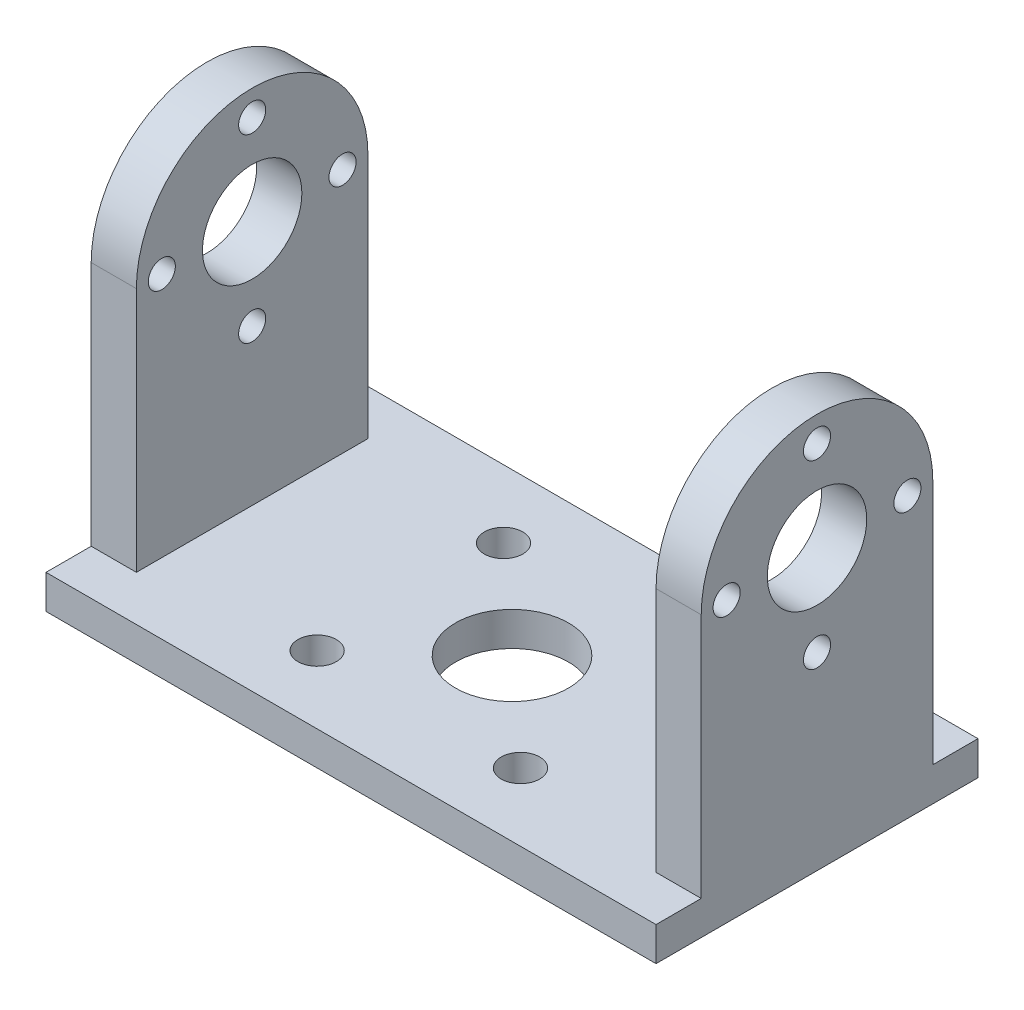
ISO-10303-21;
HEADER;
FILE_DESCRIPTION(('STEP AP214'),'2;1');
FILE_NAME('part.step','',(''),(''),'','','');
FILE_SCHEMA(('AUTOMOTIVE_DESIGN { 1 0 10303 214 1 1 1 1 }'));
ENDSEC;
DATA;
#1=APPLICATION_CONTEXT('core data for automotive mechanical design processes');
#2=APPLICATION_PROTOCOL_DEFINITION('international standard','automotive_design',2000,#1);
#3=PRODUCT_CONTEXT('',#1,'mechanical');
#4=PRODUCT('Part','Part','',(#3));
#5=PRODUCT_RELATED_PRODUCT_CATEGORY('part','',(#4));
#6=PRODUCT_DEFINITION_FORMATION('','',#4);
#7=PRODUCT_DEFINITION_CONTEXT('part definition',#1,'design');
#8=PRODUCT_DEFINITION('design','',#6,#7);
#9=PRODUCT_DEFINITION_SHAPE('','',#8);
#10=(LENGTH_UNIT() NAMED_UNIT(*) SI_UNIT(.MILLI.,.METRE.));
#11=(NAMED_UNIT(*) PLANE_ANGLE_UNIT() SI_UNIT($,.RADIAN.));
#12=(NAMED_UNIT(*) SI_UNIT($,.STERADIAN.) SOLID_ANGLE_UNIT());
#13=UNCERTAINTY_MEASURE_WITH_UNIT(LENGTH_MEASURE(1.E-05),#10,'distance_accuracy_value','');
#14=(GEOMETRIC_REPRESENTATION_CONTEXT(3) GLOBAL_UNCERTAINTY_ASSIGNED_CONTEXT((#13)) GLOBAL_UNIT_ASSIGNED_CONTEXT((#10,
#11,#12)) REPRESENTATION_CONTEXT('',''));
#15=CARTESIAN_POINT('',(0.,0.,0.));
#16=DIRECTION('',(0.,0.,1.));
#17=DIRECTION('',(1.,0.,0.));
#18=AXIS2_PLACEMENT_3D('',#15,#16,#17);
#19=CARTESIAN_POINT('',(0.,3.,-14.25));
#20=DIRECTION('',(0.,0.,1.));
#21=DIRECTION('',(1.,0.,0.));
#22=AXIS2_PLACEMENT_3D('',#19,#20,#21);
#23=PLANE('',#22);
#24=DIRECTION('',(-1.,0.,0.));
#25=VECTOR('',#24,1.);
#26=CARTESIAN_POINT('',(0.,0.,-14.25));
#27=LINE('',#26,#25);
#28=CARTESIAN_POINT('',(27.,0.,-14.25));
#29=VERTEX_POINT('',#28);
#30=CARTESIAN_POINT('',(-27.,0.,-14.25));
#31=VERTEX_POINT('',#30);
#32=EDGE_CURVE('E227',#29,#31,#27,.T.);
#33=ORIENTED_EDGE('',*,*,#32,.T.);
#34=DIRECTION('',(0.,-1.,0.));
#35=VECTOR('',#34,1.);
#36=CARTESIAN_POINT('',(-27.,3.,-14.25));
#37=LINE('',#36,#35);
#38=CARTESIAN_POINT('',(-27.,3.,-14.25));
#39=VERTEX_POINT('',#38);
#40=EDGE_CURVE('E11',#39,#31,#37,.T.);
#41=ORIENTED_EDGE('',*,*,#40,.F.);
#42=DIRECTION('',(-1.,0.,0.));
#43=VECTOR('',#42,1.);
#44=CARTESIAN_POINT('',(0.,3.,-14.25));
#45=LINE('',#44,#43);
#46=CARTESIAN_POINT('',(27.,3.,-14.25));
#47=VERTEX_POINT('',#46);
#48=EDGE_CURVE('E228',#47,#39,#45,.T.);
#49=ORIENTED_EDGE('',*,*,#48,.F.);
#50=DIRECTION('',(0.,-1.,0.));
#51=VECTOR('',#50,1.);
#52=CARTESIAN_POINT('',(27.,3.,-14.25));
#53=LINE('',#52,#51);
#54=EDGE_CURVE('E265',#47,#29,#53,.T.);
#55=ORIENTED_EDGE('',*,*,#54,.T.);
#56=EDGE_LOOP('',(#33,#41,#49,#55));
#57=FACE_BOUND('',#56,.T.);
#58=ADVANCED_FACE('F47',(#57),#23,.F.);
#59=CARTESIAN_POINT('',(-27.,3.,0.));
#60=DIRECTION('',(1.,0.,0.));
#61=DIRECTION('',(0.,0.,-1.));
#62=AXIS2_PLACEMENT_3D('',#59,#60,#61);
#63=PLANE('',#62);
#64=CARTESIAN_POINT('',(-27.,24.75,7.99999999999989));
#65=DIRECTION('',(1.,0.,0.));
#66=DIRECTION('',(0.,0.,-1.));
#67=AXIS2_PLACEMENT_3D('',#64,#65,#66);
#68=CIRCLE('',#67,1.2);
#69=CARTESIAN_POINT('',(-27.,24.75,6.79999999999989));
#70=VERTEX_POINT('',#69);
#71=EDGE_CURVE('E418',#70,#70,#68,.T.);
#72=ORIENTED_EDGE('',*,*,#71,.T.);
#73=EDGE_LOOP('',(#72));
#74=FACE_BOUND('',#73,.T.);
#75=CARTESIAN_POINT('',(-27.,16.7500000000001,-1.46081976924363E-13));
#76=DIRECTION('',(1.,0.,0.));
#77=DIRECTION('',(0.,0.,-1.));
#78=AXIS2_PLACEMENT_3D('',#75,#76,#77);
#79=CIRCLE('',#78,1.2);
#80=CARTESIAN_POINT('',(-27.,16.7500000000001,-1.20000000000015));
#81=VERTEX_POINT('',#80);
#82=EDGE_CURVE('E409',#81,#81,#79,.T.);
#83=ORIENTED_EDGE('',*,*,#82,.T.);
#84=EDGE_LOOP('',(#83));
#85=FACE_BOUND('',#84,.T.);
#86=CARTESIAN_POINT('',(-27.,24.7500000000001,-8.00000000000004));
#87=DIRECTION('',(1.,0.,0.));
#88=DIRECTION('',(0.,0.,-1.));
#89=AXIS2_PLACEMENT_3D('',#86,#87,#88);
#90=CIRCLE('',#89,1.2);
#91=CARTESIAN_POINT('',(-27.,24.7500000000001,-9.20000000000004));
#92=VERTEX_POINT('',#91);
#93=EDGE_CURVE('E433',#92,#92,#90,.T.);
#94=ORIENTED_EDGE('',*,*,#93,.T.);
#95=EDGE_LOOP('',(#94));
#96=FACE_BOUND('',#95,.T.);
#97=CARTESIAN_POINT('',(-27.,32.75,0.));
#98=DIRECTION('',(1.,0.,0.));
#99=DIRECTION('',(0.,0.,-1.));
#100=AXIS2_PLACEMENT_3D('',#97,#98,#99);
#101=CIRCLE('',#100,1.2);
#102=CARTESIAN_POINT('',(-27.,32.75,-1.2));
#103=VERTEX_POINT('',#102);
#104=EDGE_CURVE('E425',#103,#103,#101,.T.);
#105=ORIENTED_EDGE('',*,*,#104,.T.);
#106=EDGE_LOOP('',(#105));
#107=FACE_BOUND('',#106,.T.);
#108=CARTESIAN_POINT('',(-27.,24.75,0.));
#109=DIRECTION('',(1.,0.,0.));
#110=DIRECTION('',(0.,0.,-1.));
#111=AXIS2_PLACEMENT_3D('',#108,#109,#110);
#112=CIRCLE('',#111,4.4);
#113=CARTESIAN_POINT('',(-27.,24.75,-4.4));
#114=VERTEX_POINT('',#113);
#115=EDGE_CURVE('E401',#114,#114,#112,.T.);
#116=ORIENTED_EDGE('',*,*,#115,.T.);
#117=EDGE_LOOP('',(#116));
#118=FACE_BOUND('',#117,.T.);
#119=DIRECTION('',(0.,-1.,0.));
#120=VECTOR('',#119,1.);
#121=CARTESIAN_POINT('',(-27.,24.75,10.25));
#122=LINE('',#121,#120);
#123=CARTESIAN_POINT('',(-27.,24.75,10.25));
#124=VERTEX_POINT('',#123);
#125=CARTESIAN_POINT('',(-27.,3.,10.25));
#126=VERTEX_POINT('',#125);
#127=EDGE_CURVE('E151',#124,#126,#122,.T.);
#128=ORIENTED_EDGE('',*,*,#127,.F.);
#129=CARTESIAN_POINT('',(-27.,24.75,0.));
#130=DIRECTION('',(1.,0.,0.));
#131=DIRECTION('',(0.,0.,-1.));
#132=AXIS2_PLACEMENT_3D('',#129,#130,#131);
#133=CIRCLE('',#132,10.25);
#134=CARTESIAN_POINT('',(-27.,24.75,-10.25));
#135=VERTEX_POINT('',#134);
#136=EDGE_CURVE('E134',#135,#124,#133,.T.);
#137=ORIENTED_EDGE('',*,*,#136,.F.);
#138=DIRECTION('',(0.,-1.,0.));
#139=VECTOR('',#138,1.);
#140=CARTESIAN_POINT('',(-27.,24.75,-10.25));
#141=LINE('',#140,#139);
#142=CARTESIAN_POINT('',(-27.,3.,-10.25));
#143=VERTEX_POINT('',#142);
#144=EDGE_CURVE('E167',#135,#143,#141,.T.);
#145=ORIENTED_EDGE('',*,*,#144,.T.);
#146=DIRECTION('',(0.,0.,1.));
#147=VECTOR('',#146,1.);
#148=CARTESIAN_POINT('',(-27.,3.,0.));
#149=LINE('',#148,#147);
#150=EDGE_CURVE('E233',#39,#143,#149,.T.);
#151=ORIENTED_EDGE('',*,*,#150,.F.);
#152=ORIENTED_EDGE('',*,*,#40,.T.);
#153=DIRECTION('',(0.,0.,1.));
#154=VECTOR('',#153,1.);
#155=CARTESIAN_POINT('',(-27.,0.,0.));
#156=LINE('',#155,#154);
#157=CARTESIAN_POINT('',(-27.,0.,14.25));
#158=VERTEX_POINT('',#157);
#159=EDGE_CURVE('E269',#31,#158,#156,.T.);
#160=ORIENTED_EDGE('',*,*,#159,.T.);
#161=DIRECTION('',(0.,-1.,0.));
#162=VECTOR('',#161,1.);
#163=CARTESIAN_POINT('',(-27.,3.,14.25));
#164=LINE('',#163,#162);
#165=CARTESIAN_POINT('',(-27.,3.,14.25));
#166=VERTEX_POINT('',#165);
#167=EDGE_CURVE('E55',#166,#158,#164,.T.);
#168=ORIENTED_EDGE('',*,*,#167,.F.);
#169=EDGE_CURVE('E154',#126,#166,#149,.T.);
#170=ORIENTED_EDGE('',*,*,#169,.F.);
#171=EDGE_LOOP('',(#128,#137,#145,#151,#152,#160,#168,#170));
#172=FACE_BOUND('',#171,.T.);
#173=ADVANCED_FACE('F152',(#74,#85,#96,#107,#118,#172),#63,.F.);
#174=CARTESIAN_POINT('',(0.,3.,14.25));
#175=DIRECTION('',(0.,0.,1.));
#176=DIRECTION('',(1.,0.,0.));
#177=AXIS2_PLACEMENT_3D('',#174,#175,#176);
#178=PLANE('',#177);
#179=DIRECTION('',(-1.,0.,0.));
#180=VECTOR('',#179,1.);
#181=CARTESIAN_POINT('',(0.,0.,14.25));
#182=LINE('',#181,#180);
#183=CARTESIAN_POINT('',(27.,0.,14.25));
#184=VERTEX_POINT('',#183);
#185=EDGE_CURVE('E273',#184,#158,#182,.T.);
#186=ORIENTED_EDGE('',*,*,#185,.F.);
#187=DIRECTION('',(0.,-1.,0.));
#188=VECTOR('',#187,1.);
#189=CARTESIAN_POINT('',(27.,3.,14.25));
#190=LINE('',#189,#188);
#191=CARTESIAN_POINT('',(27.,3.,14.25));
#192=VERTEX_POINT('',#191);
#193=EDGE_CURVE('E302',#192,#184,#190,.T.);
#194=ORIENTED_EDGE('',*,*,#193,.F.);
#195=DIRECTION('',(-1.,0.,0.));
#196=VECTOR('',#195,1.);
#197=CARTESIAN_POINT('',(0.,3.,14.25));
#198=LINE('',#197,#196);
#199=EDGE_CURVE('E236',#192,#166,#198,.T.);
#200=ORIENTED_EDGE('',*,*,#199,.T.);
#201=ORIENTED_EDGE('',*,*,#167,.T.);
#202=EDGE_LOOP('',(#186,#194,#200,#201));
#203=FACE_BOUND('',#202,.T.);
#204=ADVANCED_FACE('F307',(#203),#178,.T.);
#205=CARTESIAN_POINT('',(0.,3.,0.));
#206=DIRECTION('',(0.,-1.,0.));
#207=DIRECTION('',(0.,0.,-1.));
#208=AXIS2_PLACEMENT_3D('',#205,#206,#207);
#209=CYLINDRICAL_SURFACE('',#208,5.);
#210=CARTESIAN_POINT('',(0.,3.,0.));
#211=DIRECTION('',(0.,1.,0.));
#212=DIRECTION('',(0.,0.,1.));
#213=AXIS2_PLACEMENT_3D('',#210,#211,#212);
#214=CIRCLE('',#213,5.);
#215=CARTESIAN_POINT('',(0.,3.,4.99999999999999));
#216=VERTEX_POINT('',#215);
#217=EDGE_CURVE('E257',#216,#216,#214,.T.);
#218=ORIENTED_EDGE('',*,*,#217,.T.);
#219=EDGE_LOOP('',(#218));
#220=FACE_BOUND('',#219,.T.);
#221=CARTESIAN_POINT('',(0.,0.,0.));
#222=DIRECTION('',(0.,1.,0.));
#223=DIRECTION('',(0.,0.,1.));
#224=AXIS2_PLACEMENT_3D('',#221,#222,#223);
#225=CIRCLE('',#224,5.);
#226=CARTESIAN_POINT('',(0.,0.,4.99999999999999));
#227=VERTEX_POINT('',#226);
#228=EDGE_CURVE('E293',#227,#227,#225,.T.);
#229=ORIENTED_EDGE('',*,*,#228,.F.);
#230=EDGE_LOOP('',(#229));
#231=FACE_BOUND('',#230,.T.);
#232=ADVANCED_FACE('F709',(#220,#231),#209,.F.);
#233=CARTESIAN_POINT('',(-9.,3.,-8.25000000000001));
#234=DIRECTION('',(0.,-1.,0.));
#235=DIRECTION('',(0.,0.,-1.));
#236=AXIS2_PLACEMENT_3D('',#233,#234,#235);
#237=CYLINDRICAL_SURFACE('',#236,1.7);
#238=CARTESIAN_POINT('',(-9.,3.,-8.25000000000001));
#239=DIRECTION('',(0.,1.,0.));
#240=DIRECTION('',(0.,0.,1.));
#241=AXIS2_PLACEMENT_3D('',#238,#239,#240);
#242=CIRCLE('',#241,1.7);
#243=CARTESIAN_POINT('',(-9.,3.,-6.55000000000001));
#244=VERTEX_POINT('',#243);
#245=EDGE_CURVE('E253',#244,#244,#242,.T.);
#246=ORIENTED_EDGE('',*,*,#245,.T.);
#247=EDGE_LOOP('',(#246));
#248=FACE_BOUND('',#247,.T.);
#249=CARTESIAN_POINT('',(-9.,0.,-8.25000000000001));
#250=DIRECTION('',(0.,1.,0.));
#251=DIRECTION('',(0.,0.,1.));
#252=AXIS2_PLACEMENT_3D('',#249,#250,#251);
#253=CIRCLE('',#252,1.7);
#254=CARTESIAN_POINT('',(-9.,0.,-6.55000000000001));
#255=VERTEX_POINT('',#254);
#256=EDGE_CURVE('E289',#255,#255,#253,.T.);
#257=ORIENTED_EDGE('',*,*,#256,.F.);
#258=EDGE_LOOP('',(#257));
#259=FACE_BOUND('',#258,.T.);
#260=ADVANCED_FACE('F700',(#248,#259),#237,.F.);
#261=CARTESIAN_POINT('',(-9.,3.,8.24999999999999));
#262=DIRECTION('',(0.,-1.,0.));
#263=DIRECTION('',(0.,0.,-1.));
#264=AXIS2_PLACEMENT_3D('',#261,#262,#263);
#265=CYLINDRICAL_SURFACE('',#264,1.7);
#266=CARTESIAN_POINT('',(-9.,3.,8.24999999999999));
#267=DIRECTION('',(0.,1.,0.));
#268=DIRECTION('',(0.,0.,1.));
#269=AXIS2_PLACEMENT_3D('',#266,#267,#268);
#270=CIRCLE('',#269,1.7);
#271=CARTESIAN_POINT('',(-9.,3.,9.94999999999999));
#272=VERTEX_POINT('',#271);
#273=EDGE_CURVE('E249',#272,#272,#270,.T.);
#274=ORIENTED_EDGE('',*,*,#273,.T.);
#275=EDGE_LOOP('',(#274));
#276=FACE_BOUND('',#275,.T.);
#277=CARTESIAN_POINT('',(-9.,0.,8.24999999999999));
#278=DIRECTION('',(0.,1.,0.));
#279=DIRECTION('',(0.,0.,1.));
#280=AXIS2_PLACEMENT_3D('',#277,#278,#279);
#281=CIRCLE('',#280,1.7);
#282=CARTESIAN_POINT('',(-9.,0.,9.94999999999999));
#283=VERTEX_POINT('',#282);
#284=EDGE_CURVE('E285',#283,#283,#281,.T.);
#285=ORIENTED_EDGE('',*,*,#284,.F.);
#286=EDGE_LOOP('',(#285));
#287=FACE_BOUND('',#286,.T.);
#288=ADVANCED_FACE('F691',(#276,#287),#265,.F.);
#289=CARTESIAN_POINT('',(9.,3.,8.24999999999999));
#290=DIRECTION('',(0.,-1.,0.));
#291=DIRECTION('',(0.,0.,-1.));
#292=AXIS2_PLACEMENT_3D('',#289,#290,#291);
#293=CYLINDRICAL_SURFACE('',#292,1.7);
#294=CARTESIAN_POINT('',(9.,3.,8.24999999999999));
#295=DIRECTION('',(0.,1.,0.));
#296=DIRECTION('',(0.,0.,1.));
#297=AXIS2_PLACEMENT_3D('',#294,#295,#296);
#298=CIRCLE('',#297,1.7);
#299=CARTESIAN_POINT('',(9.,3.,9.94999999999999));
#300=VERTEX_POINT('',#299);
#301=EDGE_CURVE('E245',#300,#300,#298,.F.);
#302=ORIENTED_EDGE('',*,*,#301,.F.);
#303=EDGE_LOOP('',(#302));
#304=FACE_BOUND('',#303,.T.);
#305=CARTESIAN_POINT('',(9.,0.,8.24999999999999));
#306=DIRECTION('',(0.,1.,0.));
#307=DIRECTION('',(0.,0.,1.));
#308=AXIS2_PLACEMENT_3D('',#305,#306,#307);
#309=CIRCLE('',#308,1.7);
#310=CARTESIAN_POINT('',(9.,0.,9.94999999999999));
#311=VERTEX_POINT('',#310);
#312=EDGE_CURVE('E281',#311,#311,#309,.F.);
#313=ORIENTED_EDGE('',*,*,#312,.T.);
#314=EDGE_LOOP('',(#313));
#315=FACE_BOUND('',#314,.T.);
#316=ADVANCED_FACE('F540',(#304,#315),#293,.F.);
#317=CARTESIAN_POINT('',(27.,3.,0.));
#318=DIRECTION('',(1.,0.,0.));
#319=DIRECTION('',(0.,0.,-1.));
#320=AXIS2_PLACEMENT_3D('',#317,#318,#319);
#321=PLANE('',#320);
#322=CARTESIAN_POINT('',(27.,24.75,7.99999999999988));
#323=DIRECTION('',(1.,0.,0.));
#324=DIRECTION('',(0.,0.,-1.));
#325=AXIS2_PLACEMENT_3D('',#322,#323,#324);
#326=CIRCLE('',#325,1.2);
#327=CARTESIAN_POINT('',(27.,24.75,6.79999999999988));
#328=VERTEX_POINT('',#327);
#329=EDGE_CURVE('E378',#328,#328,#326,.T.);
#330=ORIENTED_EDGE('',*,*,#329,.F.);
#331=EDGE_LOOP('',(#330));
#332=FACE_BOUND('',#331,.T.);
#333=CARTESIAN_POINT('',(27.,16.7500000000001,-1.55942510366757E-13));
#334=DIRECTION('',(1.,0.,0.));
#335=DIRECTION('',(0.,0.,-1.));
#336=AXIS2_PLACEMENT_3D('',#333,#334,#335);
#337=CIRCLE('',#336,1.2);
#338=CARTESIAN_POINT('',(27.,16.7500000000001,-1.20000000000016));
#339=VERTEX_POINT('',#338);
#340=EDGE_CURVE('E369',#339,#339,#337,.T.);
#341=ORIENTED_EDGE('',*,*,#340,.F.);
#342=EDGE_LOOP('',(#341));
#343=FACE_BOUND('',#342,.T.);
#344=CARTESIAN_POINT('',(27.,24.7500000000001,-8.00000000000004));
#345=DIRECTION('',(1.,0.,0.));
#346=DIRECTION('',(0.,0.,-1.));
#347=AXIS2_PLACEMENT_3D('',#344,#345,#346);
#348=CIRCLE('',#347,1.2);
#349=CARTESIAN_POINT('',(27.,24.7500000000001,-9.20000000000005));
#350=VERTEX_POINT('',#349);
#351=EDGE_CURVE('E394',#350,#350,#348,.T.);
#352=ORIENTED_EDGE('',*,*,#351,.F.);
#353=EDGE_LOOP('',(#352));
#354=FACE_BOUND('',#353,.T.);
#355=CARTESIAN_POINT('',(27.,32.75,0.));
#356=DIRECTION('',(1.,0.,0.));
#357=DIRECTION('',(0.,0.,-1.));
#358=AXIS2_PLACEMENT_3D('',#355,#356,#357);
#359=CIRCLE('',#358,1.2);
#360=CARTESIAN_POINT('',(27.,32.75,-1.20000000000001));
#361=VERTEX_POINT('',#360);
#362=EDGE_CURVE('E385',#361,#361,#359,.T.);
#363=ORIENTED_EDGE('',*,*,#362,.F.);
#364=EDGE_LOOP('',(#363));
#365=FACE_BOUND('',#364,.T.);
#366=CARTESIAN_POINT('',(27.,24.75,0.));
#367=DIRECTION('',(1.,0.,0.));
#368=DIRECTION('',(0.,0.,-1.));
#369=AXIS2_PLACEMENT_3D('',#366,#367,#368);
#370=CIRCLE('',#369,4.4);
#371=CARTESIAN_POINT('',(27.,24.75,-4.40000000000001));
#372=VERTEX_POINT('',#371);
#373=EDGE_CURVE('E361',#372,#372,#370,.T.);
#374=ORIENTED_EDGE('',*,*,#373,.F.);
#375=EDGE_LOOP('',(#374));
#376=FACE_BOUND('',#375,.T.);
#377=DIRECTION('',(0.,-1.,0.));
#378=VECTOR('',#377,1.);
#379=CARTESIAN_POINT('',(27.,24.75,-10.25));
#380=LINE('',#379,#378);
#381=CARTESIAN_POINT('',(27.,24.75,-10.25));
#382=VERTEX_POINT('',#381);
#383=CARTESIAN_POINT('',(27.,3.,-10.25));
#384=VERTEX_POINT('',#383);
#385=EDGE_CURVE('E223',#382,#384,#380,.T.);
#386=ORIENTED_EDGE('',*,*,#385,.F.);
#387=CARTESIAN_POINT('',(27.,24.75,0.));
#388=DIRECTION('',(1.,0.,0.));
#389=DIRECTION('',(0.,0.,-1.));
#390=AXIS2_PLACEMENT_3D('',#387,#388,#389);
#391=CIRCLE('',#390,10.25);
#392=CARTESIAN_POINT('',(27.,24.75,10.25));
#393=VERTEX_POINT('',#392);
#394=EDGE_CURVE('E158',#382,#393,#391,.T.);
#395=ORIENTED_EDGE('',*,*,#394,.T.);
#396=DIRECTION('',(0.,-1.,0.));
#397=VECTOR('',#396,1.);
#398=CARTESIAN_POINT('',(27.,24.75,10.25));
#399=LINE('',#398,#397);
#400=CARTESIAN_POINT('',(27.,3.,10.25));
#401=VERTEX_POINT('',#400);
#402=EDGE_CURVE('E201',#393,#401,#399,.T.);
#403=ORIENTED_EDGE('',*,*,#402,.T.);
#404=DIRECTION('',(0.,0.,1.));
#405=VECTOR('',#404,1.);
#406=CARTESIAN_POINT('',(27.,3.,0.));
#407=LINE('',#406,#405);
#408=EDGE_CURVE('E240',#401,#192,#407,.T.);
#409=ORIENTED_EDGE('',*,*,#408,.T.);
#410=ORIENTED_EDGE('',*,*,#193,.T.);
#411=DIRECTION('',(0.,0.,1.));
#412=VECTOR('',#411,1.);
#413=CARTESIAN_POINT('',(27.,0.,0.));
#414=LINE('',#413,#412);
#415=EDGE_CURVE('E277',#29,#184,#414,.T.);
#416=ORIENTED_EDGE('',*,*,#415,.F.);
#417=ORIENTED_EDGE('',*,*,#54,.F.);
#418=EDGE_CURVE('E241',#47,#384,#407,.T.);
#419=ORIENTED_EDGE('',*,*,#418,.T.);
#420=EDGE_LOOP('',(#386,#395,#403,#409,#410,#416,#417,#419));
#421=FACE_BOUND('',#420,.T.);
#422=ADVANCED_FACE('F317',(#332,#343,#354,#365,#376,#421),#321,.T.);
#423=CARTESIAN_POINT('',(9.,3.,-8.25000000000001));
#424=DIRECTION('',(0.,-1.,0.));
#425=DIRECTION('',(0.,0.,-1.));
#426=AXIS2_PLACEMENT_3D('',#423,#424,#425);
#427=CYLINDRICAL_SURFACE('',#426,1.7);
#428=CARTESIAN_POINT('',(9.,3.,-8.25000000000001));
#429=DIRECTION('',(0.,1.,0.));
#430=DIRECTION('',(0.,0.,1.));
#431=AXIS2_PLACEMENT_3D('',#428,#429,#430);
#432=CIRCLE('',#431,1.7);
#433=CARTESIAN_POINT('',(9.,3.,-6.55000000000001));
#434=VERTEX_POINT('',#433);
#435=EDGE_CURVE('E261',#434,#434,#432,.F.);
#436=ORIENTED_EDGE('',*,*,#435,.F.);
#437=EDGE_LOOP('',(#436));
#438=FACE_BOUND('',#437,.T.);
#439=CARTESIAN_POINT('',(9.,0.,-8.25000000000001));
#440=DIRECTION('',(0.,1.,0.));
#441=DIRECTION('',(0.,0.,1.));
#442=AXIS2_PLACEMENT_3D('',#439,#440,#441);
#443=CIRCLE('',#442,1.7);
#444=CARTESIAN_POINT('',(9.,0.,-6.55000000000001));
#445=VERTEX_POINT('',#444);
#446=EDGE_CURVE('E232',#445,#445,#443,.F.);
#447=ORIENTED_EDGE('',*,*,#446,.T.);
#448=EDGE_LOOP('',(#447));
#449=FACE_BOUND('',#448,.T.);
#450=ADVANCED_FACE('F513',(#438,#449),#427,.F.);
#451=CARTESIAN_POINT('',(0.,3.,0.));
#452=DIRECTION('',(0.,1.,0.));
#453=DIRECTION('',(0.,0.,1.));
#454=AXIS2_PLACEMENT_3D('',#451,#452,#453);
#455=PLANE('',#454);
#456=DIRECTION('',(-1.,0.,0.));
#457=VECTOR('',#456,1.);
#458=CARTESIAN_POINT('',(-27.,3.,10.25));
#459=LINE('',#458,#457);
#460=CARTESIAN_POINT('',(-23.,3.,10.25));
#461=VERTEX_POINT('',#460);
#462=EDGE_CURVE('E172',#461,#126,#459,.T.);
#463=ORIENTED_EDGE('',*,*,#462,.T.);
#464=ORIENTED_EDGE('',*,*,#169,.T.);
#465=ORIENTED_EDGE('',*,*,#199,.F.);
#466=ORIENTED_EDGE('',*,*,#408,.F.);
#467=DIRECTION('',(1.,0.,0.));
#468=VECTOR('',#467,1.);
#469=CARTESIAN_POINT('',(27.,3.,10.25));
#470=LINE('',#469,#468);
#471=CARTESIAN_POINT('',(23.,3.,10.25));
#472=VERTEX_POINT('',#471);
#473=EDGE_CURVE('E197',#472,#401,#470,.T.);
#474=ORIENTED_EDGE('',*,*,#473,.F.);
#475=DIRECTION('',(0.,0.,1.));
#476=VECTOR('',#475,1.);
#477=CARTESIAN_POINT('',(23.,3.,-10.25));
#478=LINE('',#477,#476);
#479=CARTESIAN_POINT('',(23.,3.,-10.25));
#480=VERTEX_POINT('',#479);
#481=EDGE_CURVE('E205',#480,#472,#478,.T.);
#482=ORIENTED_EDGE('',*,*,#481,.F.);
#483=DIRECTION('',(-1.,0.,0.));
#484=VECTOR('',#483,1.);
#485=CARTESIAN_POINT('',(27.,3.,-10.25));
#486=LINE('',#485,#484);
#487=EDGE_CURVE('E188',#384,#480,#486,.T.);
#488=ORIENTED_EDGE('',*,*,#487,.F.);
#489=ORIENTED_EDGE('',*,*,#418,.F.);
#490=ORIENTED_EDGE('',*,*,#48,.T.);
#491=ORIENTED_EDGE('',*,*,#150,.T.);
#492=DIRECTION('',(1.,0.,0.));
#493=VECTOR('',#492,1.);
#494=CARTESIAN_POINT('',(-27.,3.,-10.25));
#495=LINE('',#494,#493);
#496=CARTESIAN_POINT('',(-23.,3.,-10.25));
#497=VERTEX_POINT('',#496);
#498=EDGE_CURVE('E67',#143,#497,#495,.T.);
#499=ORIENTED_EDGE('',*,*,#498,.T.);
#500=DIRECTION('',(0.,0.,1.));
#501=VECTOR('',#500,1.);
#502=CARTESIAN_POINT('',(-23.,3.,-10.25));
#503=LINE('',#502,#501);
#504=EDGE_CURVE('E62',#497,#461,#503,.T.);
#505=ORIENTED_EDGE('',*,*,#504,.T.);
#506=EDGE_LOOP('',(#463,#464,#465,#466,#474,#482,#488,#489,#490,#491,#499,#505));
#507=FACE_BOUND('',#506,.T.);
#508=ORIENTED_EDGE('',*,*,#301,.T.);
#509=EDGE_LOOP('',(#508));
#510=FACE_BOUND('',#509,.T.);
#511=ORIENTED_EDGE('',*,*,#273,.F.);
#512=EDGE_LOOP('',(#511));
#513=FACE_BOUND('',#512,.T.);
#514=ORIENTED_EDGE('',*,*,#245,.F.);
#515=EDGE_LOOP('',(#514));
#516=FACE_BOUND('',#515,.T.);
#517=ORIENTED_EDGE('',*,*,#217,.F.);
#518=EDGE_LOOP('',(#517));
#519=FACE_BOUND('',#518,.T.);
#520=ORIENTED_EDGE('',*,*,#435,.T.);
#521=EDGE_LOOP('',(#520));
#522=FACE_BOUND('',#521,.T.);
#523=ADVANCED_FACE('F319',(#507,#510,#513,#516,#519,#522),#455,.T.);
#524=CARTESIAN_POINT('',(0.,0.,0.));
#525=DIRECTION('',(0.,1.,0.));
#526=DIRECTION('',(0.,0.,1.));
#527=AXIS2_PLACEMENT_3D('',#524,#525,#526);
#528=PLANE('',#527);
#529=ORIENTED_EDGE('',*,*,#32,.F.);
#530=ORIENTED_EDGE('',*,*,#415,.T.);
#531=ORIENTED_EDGE('',*,*,#185,.T.);
#532=ORIENTED_EDGE('',*,*,#159,.F.);
#533=EDGE_LOOP('',(#529,#530,#531,#532));
#534=FACE_BOUND('',#533,.T.);
#535=ORIENTED_EDGE('',*,*,#312,.F.);
#536=EDGE_LOOP('',(#535));
#537=FACE_BOUND('',#536,.T.);
#538=ORIENTED_EDGE('',*,*,#284,.T.);
#539=EDGE_LOOP('',(#538));
#540=FACE_BOUND('',#539,.T.);
#541=ORIENTED_EDGE('',*,*,#256,.T.);
#542=EDGE_LOOP('',(#541));
#543=FACE_BOUND('',#542,.T.);
#544=ORIENTED_EDGE('',*,*,#228,.T.);
#545=EDGE_LOOP('',(#544));
#546=FACE_BOUND('',#545,.T.);
#547=ORIENTED_EDGE('',*,*,#446,.F.);
#548=EDGE_LOOP('',(#547));
#549=FACE_BOUND('',#548,.T.);
#550=ADVANCED_FACE('F313',(#534,#537,#540,#543,#546,#549),#528,.F.);
#551=CARTESIAN_POINT('',(27.,24.75,-10.25));
#552=DIRECTION('',(0.,0.,1.));
#553=DIRECTION('',(1.,0.,0.));
#554=AXIS2_PLACEMENT_3D('',#551,#552,#553);
#555=PLANE('',#554);
#556=ORIENTED_EDGE('',*,*,#487,.T.);
#557=DIRECTION('',(0.,-1.,0.));
#558=VECTOR('',#557,1.);
#559=CARTESIAN_POINT('',(23.,24.75,-10.25));
#560=LINE('',#559,#558);
#561=CARTESIAN_POINT('',(23.,24.75,-10.25));
#562=VERTEX_POINT('',#561);
#563=EDGE_CURVE('E219',#562,#480,#560,.T.);
#564=ORIENTED_EDGE('',*,*,#563,.F.);
#565=DIRECTION('',(-1.,0.,0.));
#566=VECTOR('',#565,1.);
#567=CARTESIAN_POINT('',(27.,24.75,-10.25));
#568=LINE('',#567,#566);
#569=EDGE_CURVE('E192',#382,#562,#568,.T.);
#570=ORIENTED_EDGE('',*,*,#569,.F.);
#571=ORIENTED_EDGE('',*,*,#385,.T.);
#572=EDGE_LOOP('',(#556,#564,#570,#571));
#573=FACE_BOUND('',#572,.T.);
#574=ADVANCED_FACE('F335',(#573),#555,.F.);
#575=CARTESIAN_POINT('',(23.,24.75,-10.25));
#576=DIRECTION('',(1.,0.,0.));
#577=DIRECTION('',(0.,0.,-1.));
#578=AXIS2_PLACEMENT_3D('',#575,#576,#577);
#579=PLANE('',#578);
#580=CARTESIAN_POINT('',(23.,24.75,7.99999999999988));
#581=DIRECTION('',(1.,0.,0.));
#582=DIRECTION('',(0.,0.,-1.));
#583=AXIS2_PLACEMENT_3D('',#580,#581,#582);
#584=CIRCLE('',#583,1.2);
#585=CARTESIAN_POINT('',(23.,24.75,6.79999999999988));
#586=VERTEX_POINT('',#585);
#587=EDGE_CURVE('E365',#586,#586,#584,.T.);
#588=ORIENTED_EDGE('',*,*,#587,.T.);
#589=EDGE_LOOP('',(#588));
#590=FACE_BOUND('',#589,.T.);
#591=CARTESIAN_POINT('',(23.,16.7500000000001,-1.55455570443676E-13));
#592=DIRECTION('',(1.,0.,0.));
#593=DIRECTION('',(0.,0.,-1.));
#594=AXIS2_PLACEMENT_3D('',#591,#592,#593);
#595=CIRCLE('',#594,1.2);
#596=CARTESIAN_POINT('',(23.,16.7500000000001,-1.20000000000016));
#597=VERTEX_POINT('',#596);
#598=EDGE_CURVE('E373',#597,#597,#595,.T.);
#599=ORIENTED_EDGE('',*,*,#598,.T.);
#600=EDGE_LOOP('',(#599));
#601=FACE_BOUND('',#600,.T.);
#602=CARTESIAN_POINT('',(23.,24.7500000000001,-8.00000000000004));
#603=DIRECTION('',(1.,0.,0.));
#604=DIRECTION('',(0.,0.,-1.));
#605=AXIS2_PLACEMENT_3D('',#602,#603,#604);
#606=CIRCLE('',#605,1.2);
#607=CARTESIAN_POINT('',(23.,24.7500000000001,-9.20000000000005));
#608=VERTEX_POINT('',#607);
#609=EDGE_CURVE('E374',#608,#608,#606,.T.);
#610=ORIENTED_EDGE('',*,*,#609,.T.);
#611=EDGE_LOOP('',(#610));
#612=FACE_BOUND('',#611,.T.);
#613=CARTESIAN_POINT('',(23.,32.75,0.));
#614=DIRECTION('',(1.,0.,0.));
#615=DIRECTION('',(0.,0.,-1.));
#616=AXIS2_PLACEMENT_3D('',#613,#614,#615);
#617=CIRCLE('',#616,1.2);
#618=CARTESIAN_POINT('',(23.,32.75,-1.20000000000001));
#619=VERTEX_POINT('',#618);
#620=EDGE_CURVE('E389',#619,#619,#617,.T.);
#621=ORIENTED_EDGE('',*,*,#620,.T.);
#622=EDGE_LOOP('',(#621));
#623=FACE_BOUND('',#622,.T.);
#624=CARTESIAN_POINT('',(23.,24.75,0.));
#625=DIRECTION('',(1.,0.,0.));
#626=DIRECTION('',(0.,0.,-1.));
#627=AXIS2_PLACEMENT_3D('',#624,#625,#626);
#628=CIRCLE('',#627,4.4);
#629=CARTESIAN_POINT('',(23.,24.75,-4.40000000000001));
#630=VERTEX_POINT('',#629);
#631=EDGE_CURVE('E147',#630,#630,#628,.T.);
#632=ORIENTED_EDGE('',*,*,#631,.T.);
#633=EDGE_LOOP('',(#632));
#634=FACE_BOUND('',#633,.T.);
#635=DIRECTION('',(0.,-1.,0.));
#636=VECTOR('',#635,1.);
#637=CARTESIAN_POINT('',(23.,24.75,10.25));
#638=LINE('',#637,#636);
#639=CARTESIAN_POINT('',(23.,24.75,10.25));
#640=VERTEX_POINT('',#639);
#641=EDGE_CURVE('E215',#640,#472,#638,.T.);
#642=ORIENTED_EDGE('',*,*,#641,.F.);
#643=CARTESIAN_POINT('',(23.,24.75,0.));
#644=DIRECTION('',(1.,0.,0.));
#645=DIRECTION('',(0.,0.,-1.));
#646=AXIS2_PLACEMENT_3D('',#643,#644,#645);
#647=CIRCLE('',#646,10.25);
#648=EDGE_CURVE('E184',#562,#640,#647,.T.);
#649=ORIENTED_EDGE('',*,*,#648,.F.);
#650=ORIENTED_EDGE('',*,*,#563,.T.);
#651=ORIENTED_EDGE('',*,*,#481,.T.);
#652=EDGE_LOOP('',(#642,#649,#650,#651));
#653=FACE_BOUND('',#652,.T.);
#654=ADVANCED_FACE('F332',(#590,#601,#612,#623,#634,#653),#579,.F.);
#655=CARTESIAN_POINT('',(27.,24.75,10.25));
#656=DIRECTION('',(0.,0.,-1.));
#657=DIRECTION('',(-1.,0.,0.));
#658=AXIS2_PLACEMENT_3D('',#655,#656,#657);
#659=PLANE('',#658);
#660=ORIENTED_EDGE('',*,*,#473,.T.);
#661=ORIENTED_EDGE('',*,*,#402,.F.);
#662=DIRECTION('',(1.,0.,0.));
#663=VECTOR('',#662,1.);
#664=CARTESIAN_POINT('',(27.,24.75,10.25));
#665=LINE('',#664,#663);
#666=EDGE_CURVE('E196',#640,#393,#665,.T.);
#667=ORIENTED_EDGE('',*,*,#666,.F.);
#668=ORIENTED_EDGE('',*,*,#641,.T.);
#669=EDGE_LOOP('',(#660,#661,#667,#668));
#670=FACE_BOUND('',#669,.T.);
#671=ADVANCED_FACE('F324',(#670),#659,.F.);
#672=CARTESIAN_POINT('',(23.,24.75,0.));
#673=DIRECTION('',(1.,0.,0.));
#674=DIRECTION('',(0.,0.,-1.));
#675=AXIS2_PLACEMENT_3D('',#672,#673,#674);
#676=CYLINDRICAL_SURFACE('',#675,10.25);
#677=ORIENTED_EDGE('',*,*,#569,.T.);
#678=ORIENTED_EDGE('',*,*,#648,.T.);
#679=ORIENTED_EDGE('',*,*,#666,.T.);
#680=ORIENTED_EDGE('',*,*,#394,.F.);
#681=EDGE_LOOP('',(#677,#678,#679,#680));
#682=FACE_BOUND('',#681,.T.);
#683=ADVANCED_FACE('F329',(#682),#676,.T.);
#684=CARTESIAN_POINT('',(-27.,24.75,10.25));
#685=DIRECTION('',(0.,0.,1.));
#686=DIRECTION('',(1.,0.,0.));
#687=AXIS2_PLACEMENT_3D('',#684,#685,#686);
#688=PLANE('',#687);
#689=ORIENTED_EDGE('',*,*,#462,.F.);
#690=DIRECTION('',(0.,-1.,0.));
#691=VECTOR('',#690,1.);
#692=CARTESIAN_POINT('',(-23.,24.75,10.25));
#693=LINE('',#692,#691);
#694=CARTESIAN_POINT('',(-23.,24.75,10.25));
#695=VERTEX_POINT('',#694);
#696=EDGE_CURVE('E159',#695,#461,#693,.T.);
#697=ORIENTED_EDGE('',*,*,#696,.F.);
#698=DIRECTION('',(-1.,0.,0.));
#699=VECTOR('',#698,1.);
#700=CARTESIAN_POINT('',(-27.,24.75,10.25));
#701=LINE('',#700,#699);
#702=EDGE_CURVE('E138',#695,#124,#701,.T.);
#703=ORIENTED_EDGE('',*,*,#702,.T.);
#704=ORIENTED_EDGE('',*,*,#127,.T.);
#705=EDGE_LOOP('',(#689,#697,#703,#704));
#706=FACE_BOUND('',#705,.T.);
#707=ADVANCED_FACE('F162',(#706),#688,.T.);
#708=CARTESIAN_POINT('',(-23.,24.75,-10.25));
#709=DIRECTION('',(1.,0.,0.));
#710=DIRECTION('',(0.,0.,-1.));
#711=AXIS2_PLACEMENT_3D('',#708,#709,#710);
#712=PLANE('',#711);
#713=CARTESIAN_POINT('',(-23.,24.75,7.99999999999989));
#714=DIRECTION('',(1.,0.,0.));
#715=DIRECTION('',(0.,0.,-1.));
#716=AXIS2_PLACEMENT_3D('',#713,#714,#715);
#717=CIRCLE('',#716,1.2);
#718=CARTESIAN_POINT('',(-23.,24.75,6.79999999999989));
#719=VERTEX_POINT('',#718);
#720=EDGE_CURVE('E405',#719,#719,#717,.T.);
#721=ORIENTED_EDGE('',*,*,#720,.F.);
#722=EDGE_LOOP('',(#721));
#723=FACE_BOUND('',#722,.T.);
#724=CARTESIAN_POINT('',(-23.,16.7500000000001,-1.47055856770525E-13));
#725=DIRECTION('',(1.,0.,0.));
#726=DIRECTION('',(0.,0.,-1.));
#727=AXIS2_PLACEMENT_3D('',#724,#725,#726);
#728=CIRCLE('',#727,1.2);
#729=CARTESIAN_POINT('',(-23.,16.7500000000001,-1.20000000000015));
#730=VERTEX_POINT('',#729);
#731=EDGE_CURVE('E413',#730,#730,#728,.T.);
#732=ORIENTED_EDGE('',*,*,#731,.F.);
#733=EDGE_LOOP('',(#732));
#734=FACE_BOUND('',#733,.T.);
#735=CARTESIAN_POINT('',(-23.,24.7500000000001,-8.00000000000004));
#736=DIRECTION('',(1.,0.,0.));
#737=DIRECTION('',(0.,0.,-1.));
#738=AXIS2_PLACEMENT_3D('',#735,#736,#737);
#739=CIRCLE('',#738,1.2);
#740=CARTESIAN_POINT('',(-23.,24.7500000000001,-9.20000000000004));
#741=VERTEX_POINT('',#740);
#742=EDGE_CURVE('E414',#741,#741,#739,.T.);
#743=ORIENTED_EDGE('',*,*,#742,.F.);
#744=EDGE_LOOP('',(#743));
#745=FACE_BOUND('',#744,.T.);
#746=CARTESIAN_POINT('',(-23.,32.75,0.));
#747=DIRECTION('',(1.,0.,0.));
#748=DIRECTION('',(0.,0.,-1.));
#749=AXIS2_PLACEMENT_3D('',#746,#747,#748);
#750=CIRCLE('',#749,1.2);
#751=CARTESIAN_POINT('',(-23.,32.75,-1.2));
#752=VERTEX_POINT('',#751);
#753=EDGE_CURVE('E429',#752,#752,#750,.T.);
#754=ORIENTED_EDGE('',*,*,#753,.F.);
#755=EDGE_LOOP('',(#754));
#756=FACE_BOUND('',#755,.T.);
#757=CARTESIAN_POINT('',(-23.,24.75,0.));
#758=DIRECTION('',(1.,0.,0.));
#759=DIRECTION('',(0.,0.,-1.));
#760=AXIS2_PLACEMENT_3D('',#757,#758,#759);
#761=CIRCLE('',#760,4.4);
#762=CARTESIAN_POINT('',(-23.,24.75,-4.4));
#763=VERTEX_POINT('',#762);
#764=EDGE_CURVE('E390',#763,#763,#761,.T.);
#765=ORIENTED_EDGE('',*,*,#764,.F.);
#766=EDGE_LOOP('',(#765));
#767=FACE_BOUND('',#766,.T.);
#768=DIRECTION('',(0.,-1.,0.));
#769=VECTOR('',#768,1.);
#770=CARTESIAN_POINT('',(-23.,24.75,-10.25));
#771=LINE('',#770,#769);
#772=CARTESIAN_POINT('',(-23.,24.75,-10.25));
#773=VERTEX_POINT('',#772);
#774=EDGE_CURVE('E179',#773,#497,#771,.T.);
#775=ORIENTED_EDGE('',*,*,#774,.F.);
#776=CARTESIAN_POINT('',(-23.,24.75,0.));
#777=DIRECTION('',(1.,0.,0.));
#778=DIRECTION('',(0.,0.,-1.));
#779=AXIS2_PLACEMENT_3D('',#776,#777,#778);
#780=CIRCLE('',#779,10.25);
#781=EDGE_CURVE('E146',#773,#695,#780,.T.);
#782=ORIENTED_EDGE('',*,*,#781,.T.);
#783=ORIENTED_EDGE('',*,*,#696,.T.);
#784=ORIENTED_EDGE('',*,*,#504,.F.);
#785=EDGE_LOOP('',(#775,#782,#783,#784));
#786=FACE_BOUND('',#785,.T.);
#787=ADVANCED_FACE('F358',(#723,#734,#745,#756,#767,#786),#712,.T.);
#788=CARTESIAN_POINT('',(-27.,24.75,-10.25));
#789=DIRECTION('',(0.,0.,-1.));
#790=DIRECTION('',(-1.,0.,0.));
#791=AXIS2_PLACEMENT_3D('',#788,#789,#790);
#792=PLANE('',#791);
#793=ORIENTED_EDGE('',*,*,#498,.F.);
#794=ORIENTED_EDGE('',*,*,#144,.F.);
#795=DIRECTION('',(1.,0.,0.));
#796=VECTOR('',#795,1.);
#797=CARTESIAN_POINT('',(-27.,24.75,-10.25));
#798=LINE('',#797,#796);
#799=EDGE_CURVE('E141',#135,#773,#798,.T.);
#800=ORIENTED_EDGE('',*,*,#799,.T.);
#801=ORIENTED_EDGE('',*,*,#774,.T.);
#802=EDGE_LOOP('',(#793,#794,#800,#801));
#803=FACE_BOUND('',#802,.T.);
#804=ADVANCED_FACE('F355',(#803),#792,.T.);
#805=CARTESIAN_POINT('',(-23.,24.75,0.));
#806=DIRECTION('',(-1.,0.,0.));
#807=DIRECTION('',(0.,0.,1.));
#808=AXIS2_PLACEMENT_3D('',#805,#806,#807);
#809=CYLINDRICAL_SURFACE('',#808,10.25);
#810=ORIENTED_EDGE('',*,*,#136,.T.);
#811=ORIENTED_EDGE('',*,*,#702,.F.);
#812=ORIENTED_EDGE('',*,*,#781,.F.);
#813=ORIENTED_EDGE('',*,*,#799,.F.);
#814=EDGE_LOOP('',(#810,#811,#812,#813));
#815=FACE_BOUND('',#814,.T.);
#816=ADVANCED_FACE('F136',(#815),#809,.T.);
#817=CARTESIAN_POINT('',(23.,24.75,0.));
#818=DIRECTION('',(1.,0.,0.));
#819=DIRECTION('',(0.,0.,-1.));
#820=AXIS2_PLACEMENT_3D('',#817,#818,#819);
#821=CYLINDRICAL_SURFACE('',#820,4.4);
#822=ORIENTED_EDGE('',*,*,#631,.F.);
#823=EDGE_LOOP('',(#822));
#824=FACE_BOUND('',#823,.T.);
#825=ORIENTED_EDGE('',*,*,#373,.T.);
#826=EDGE_LOOP('',(#825));
#827=FACE_BOUND('',#826,.T.);
#828=ADVANCED_FACE('F479',(#824,#827),#821,.F.);
#829=CARTESIAN_POINT('',(23.,32.75,0.));
#830=DIRECTION('',(1.,0.,0.));
#831=DIRECTION('',(0.,0.,-1.));
#832=AXIS2_PLACEMENT_3D('',#829,#830,#831);
#833=CYLINDRICAL_SURFACE('',#832,1.2);
#834=ORIENTED_EDGE('',*,*,#620,.F.);
#835=EDGE_LOOP('',(#834));
#836=FACE_BOUND('',#835,.T.);
#837=ORIENTED_EDGE('',*,*,#362,.T.);
#838=EDGE_LOOP('',(#837));
#839=FACE_BOUND('',#838,.T.);
#840=ADVANCED_FACE('F476',(#836,#839),#833,.F.);
#841=CARTESIAN_POINT('',(23.,24.7500000000001,-8.00000000000004));
#842=DIRECTION('',(1.,0.,0.));
#843=DIRECTION('',(0.,0.,-1.));
#844=AXIS2_PLACEMENT_3D('',#841,#842,#843);
#845=CYLINDRICAL_SURFACE('',#844,1.2);
#846=ORIENTED_EDGE('',*,*,#609,.F.);
#847=EDGE_LOOP('',(#846));
#848=FACE_BOUND('',#847,.T.);
#849=ORIENTED_EDGE('',*,*,#351,.T.);
#850=EDGE_LOOP('',(#849));
#851=FACE_BOUND('',#850,.T.);
#852=ADVANCED_FACE('F473',(#848,#851),#845,.F.);
#853=CARTESIAN_POINT('',(23.,16.7500000000001,-1.55455570443676E-13));
#854=DIRECTION('',(1.,0.,0.));
#855=DIRECTION('',(0.,0.,-1.));
#856=AXIS2_PLACEMENT_3D('',#853,#854,#855);
#857=CYLINDRICAL_SURFACE('',#856,1.2);
#858=ORIENTED_EDGE('',*,*,#598,.F.);
#859=EDGE_LOOP('',(#858));
#860=FACE_BOUND('',#859,.T.);
#861=ORIENTED_EDGE('',*,*,#340,.T.);
#862=EDGE_LOOP('',(#861));
#863=FACE_BOUND('',#862,.T.);
#864=ADVANCED_FACE('F466',(#860,#863),#857,.F.);
#865=CARTESIAN_POINT('',(23.,24.75,7.99999999999988));
#866=DIRECTION('',(1.,0.,0.));
#867=DIRECTION('',(0.,0.,-1.));
#868=AXIS2_PLACEMENT_3D('',#865,#866,#867);
#869=CYLINDRICAL_SURFACE('',#868,1.2);
#870=ORIENTED_EDGE('',*,*,#587,.F.);
#871=EDGE_LOOP('',(#870));
#872=FACE_BOUND('',#871,.T.);
#873=ORIENTED_EDGE('',*,*,#329,.T.);
#874=EDGE_LOOP('',(#873));
#875=FACE_BOUND('',#874,.T.);
#876=ADVANCED_FACE('F456',(#872,#875),#869,.F.);
#877=CARTESIAN_POINT('',(-23.,24.75,0.));
#878=DIRECTION('',(-1.,0.,0.));
#879=DIRECTION('',(0.,0.,1.));
#880=AXIS2_PLACEMENT_3D('',#877,#878,#879);
#881=CYLINDRICAL_SURFACE('',#880,4.4);
#882=ORIENTED_EDGE('',*,*,#764,.T.);
#883=EDGE_LOOP('',(#882));
#884=FACE_BOUND('',#883,.T.);
#885=ORIENTED_EDGE('',*,*,#115,.F.);
#886=EDGE_LOOP('',(#885));
#887=FACE_BOUND('',#886,.T.);
#888=ADVANCED_FACE('F452',(#884,#887),#881,.F.);
#889=CARTESIAN_POINT('',(-23.,32.75,0.));
#890=DIRECTION('',(-1.,0.,0.));
#891=DIRECTION('',(0.,0.,1.));
#892=AXIS2_PLACEMENT_3D('',#889,#890,#891);
#893=CYLINDRICAL_SURFACE('',#892,1.2);
#894=ORIENTED_EDGE('',*,*,#753,.T.);
#895=EDGE_LOOP('',(#894));
#896=FACE_BOUND('',#895,.T.);
#897=ORIENTED_EDGE('',*,*,#104,.F.);
#898=EDGE_LOOP('',(#897));
#899=FACE_BOUND('',#898,.T.);
#900=ADVANCED_FACE('F455',(#896,#899),#893,.F.);
#901=CARTESIAN_POINT('',(-23.,24.7500000000001,-8.00000000000004));
#902=DIRECTION('',(-1.,0.,0.));
#903=DIRECTION('',(0.,0.,1.));
#904=AXIS2_PLACEMENT_3D('',#901,#902,#903);
#905=CYLINDRICAL_SURFACE('',#904,1.2);
#906=ORIENTED_EDGE('',*,*,#742,.T.);
#907=EDGE_LOOP('',(#906));
#908=FACE_BOUND('',#907,.T.);
#909=ORIENTED_EDGE('',*,*,#93,.F.);
#910=EDGE_LOOP('',(#909));
#911=FACE_BOUND('',#910,.T.);
#912=ADVANCED_FACE('F441',(#908,#911),#905,.F.);
#913=CARTESIAN_POINT('',(-23.,16.7500000000001,-1.47055856770525E-13));
#914=DIRECTION('',(-1.,0.,0.));
#915=DIRECTION('',(0.,0.,1.));
#916=AXIS2_PLACEMENT_3D('',#913,#914,#915);
#917=CYLINDRICAL_SURFACE('',#916,1.2);
#918=ORIENTED_EDGE('',*,*,#731,.T.);
#919=EDGE_LOOP('',(#918));
#920=FACE_BOUND('',#919,.T.);
#921=ORIENTED_EDGE('',*,*,#82,.F.);
#922=EDGE_LOOP('',(#921));
#923=FACE_BOUND('',#922,.T.);
#924=ADVANCED_FACE('F471',(#920,#923),#917,.F.);
#925=CARTESIAN_POINT('',(-23.,24.75,7.99999999999989));
#926=DIRECTION('',(-1.,0.,0.));
#927=DIRECTION('',(0.,0.,1.));
#928=AXIS2_PLACEMENT_3D('',#925,#926,#927);
#929=CYLINDRICAL_SURFACE('',#928,1.2);
#930=ORIENTED_EDGE('',*,*,#720,.T.);
#931=EDGE_LOOP('',(#930));
#932=FACE_BOUND('',#931,.T.);
#933=ORIENTED_EDGE('',*,*,#71,.F.);
#934=EDGE_LOOP('',(#933));
#935=FACE_BOUND('',#934,.T.);
#936=ADVANCED_FACE('F625',(#932,#935),#929,.F.);
#937=CLOSED_SHELL('',(#58,#173,#204,#232,#260,#288,#316,#422,#450,#523,#550,#574,#654,#671,#683,
#707,#787,#804,#816,#828,#840,#852,#864,#876,#888,#900,#912,#924,#936));
#938=MANIFOLD_SOLID_BREP('B2',#937);
#939=ADVANCED_BREP_SHAPE_REPRESENTATION('',(#18,#938),#14);
#940=SHAPE_DEFINITION_REPRESENTATION(#9,#939);
ENDSEC;
END-ISO-10303-21;
